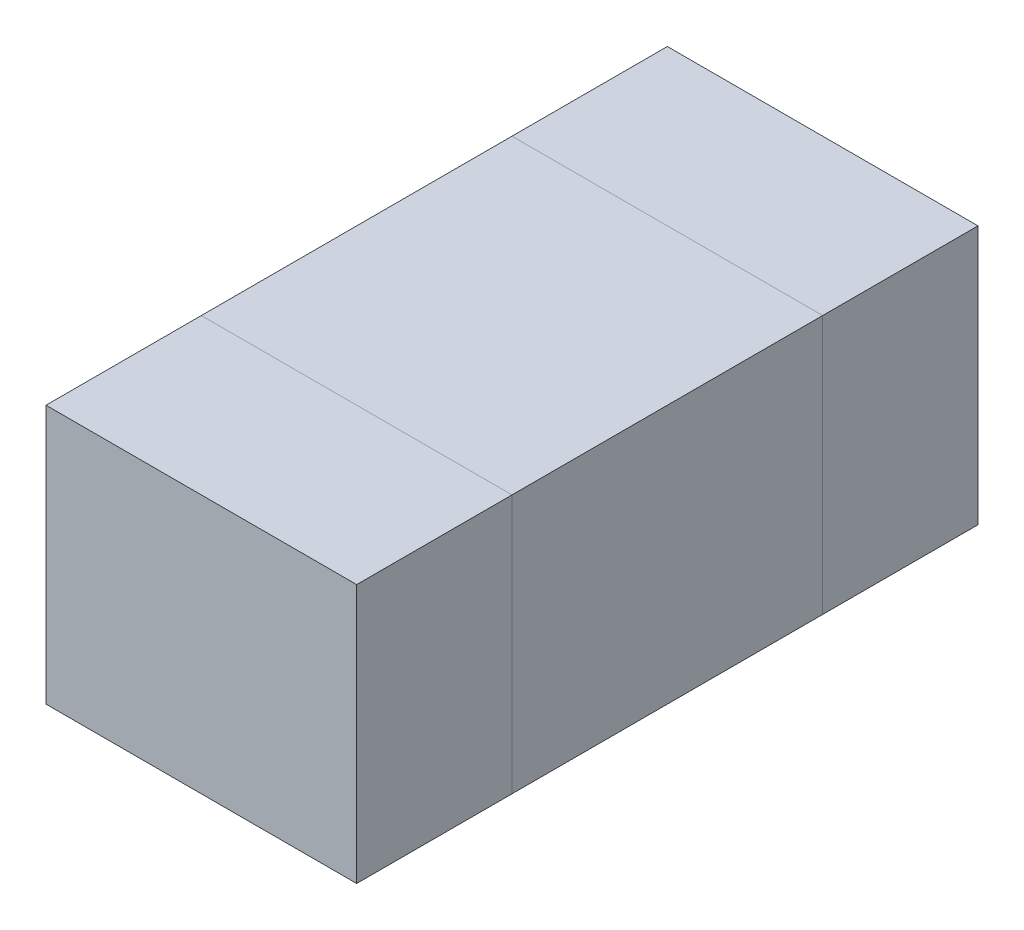
ISO-10303-21;
HEADER;
FILE_DESCRIPTION(('STEP AP214'),'2;1');
FILE_NAME('part.step','',(''),(''),'','','');
FILE_SCHEMA(('AUTOMOTIVE_DESIGN { 1 0 10303 214 1 1 1 1 }'));
ENDSEC;
DATA;
#1=APPLICATION_CONTEXT('core data for automotive mechanical design processes');
#2=APPLICATION_PROTOCOL_DEFINITION('international standard','automotive_design',2000,#1);
#3=PRODUCT_CONTEXT('',#1,'mechanical');
#4=PRODUCT('Part','Part','',(#3));
#5=PRODUCT_RELATED_PRODUCT_CATEGORY('part','',(#4));
#6=PRODUCT_DEFINITION_FORMATION('','',#4);
#7=PRODUCT_DEFINITION_CONTEXT('part definition',#1,'design');
#8=PRODUCT_DEFINITION('design','',#6,#7);
#9=PRODUCT_DEFINITION_SHAPE('','',#8);
#10=(LENGTH_UNIT() NAMED_UNIT(*) SI_UNIT(.MILLI.,.METRE.));
#11=(NAMED_UNIT(*) PLANE_ANGLE_UNIT() SI_UNIT($,.RADIAN.));
#12=(NAMED_UNIT(*) SI_UNIT($,.STERADIAN.) SOLID_ANGLE_UNIT());
#13=UNCERTAINTY_MEASURE_WITH_UNIT(LENGTH_MEASURE(1.E-05),#10,'distance_accuracy_value','');
#14=(GEOMETRIC_REPRESENTATION_CONTEXT(3) GLOBAL_UNCERTAINTY_ASSIGNED_CONTEXT((#13)) GLOBAL_UNIT_ASSIGNED_CONTEXT((#10,
#11,#12)) REPRESENTATION_CONTEXT('',''));
#15=CARTESIAN_POINT('',(0.,0.,0.));
#16=DIRECTION('',(0.,0.,1.));
#17=DIRECTION('',(1.,0.,0.));
#18=AXIS2_PLACEMENT_3D('',#15,#16,#17);
#19=CARTESIAN_POINT('',(0.,0.,0.));
#20=DIRECTION('',(0.,1.,0.));
#21=DIRECTION('',(1.,0.,0.));
#22=AXIS2_PLACEMENT_3D('',#19,#20,#21);
#23=PLANE('',#22);
#24=DIRECTION('',(0.,0.,-1.));
#25=VECTOR('',#24,1.);
#26=CARTESIAN_POINT('',(0.3,0.,-0.3));
#27=LINE('',#26,#25);
#28=CARTESIAN_POINT('',(0.3,0.,0.3));
#29=VERTEX_POINT('',#28);
#30=CARTESIAN_POINT('',(0.3,0.,-0.3));
#31=VERTEX_POINT('',#30);
#32=EDGE_CURVE('P0_E109',#29,#31,#27,.T.);
#33=ORIENTED_EDGE('',*,*,#32,.F.);
#34=DIRECTION('',(1.,0.,0.));
#35=VECTOR('',#34,1.);
#36=CARTESIAN_POINT('',(-0.3,0.,0.3));
#37=LINE('',#36,#35);
#38=CARTESIAN_POINT('',(-0.3,0.,0.3));
#39=VERTEX_POINT('',#38);
#40=EDGE_CURVE('P0_E27',#39,#29,#37,.T.);
#41=ORIENTED_EDGE('',*,*,#40,.F.);
#42=DIRECTION('',(0.,0.,1.));
#43=VECTOR('',#42,1.);
#44=CARTESIAN_POINT('',(-0.3,0.,-0.3));
#45=LINE('',#44,#43);
#46=CARTESIAN_POINT('',(-0.3,0.,-0.3));
#47=VERTEX_POINT('',#46);
#48=EDGE_CURVE('P0_E20',#47,#39,#45,.T.);
#49=ORIENTED_EDGE('',*,*,#48,.F.);
#50=DIRECTION('',(-1.,0.,0.));
#51=VECTOR('',#50,1.);
#52=CARTESIAN_POINT('',(-0.3,0.,-0.3));
#53=LINE('',#52,#51);
#54=EDGE_CURVE('P0_E76',#31,#47,#53,.T.);
#55=ORIENTED_EDGE('',*,*,#54,.F.);
#56=EDGE_LOOP('',(#33,#41,#49,#55));
#57=FACE_BOUND('',#56,.T.);
#58=ADVANCED_FACE('P0_F16',(#57),#23,.F.);
#59=CARTESIAN_POINT('',(0.,0.5,0.));
#60=DIRECTION('',(0.,1.,0.));
#61=DIRECTION('',(1.,0.,0.));
#62=AXIS2_PLACEMENT_3D('',#59,#60,#61);
#63=PLANE('',#62);
#64=DIRECTION('',(0.,0.,-1.));
#65=VECTOR('',#64,1.);
#66=CARTESIAN_POINT('',(0.3,0.5,-0.3));
#67=LINE('',#66,#65);
#68=CARTESIAN_POINT('',(0.3,0.5,0.3));
#69=VERTEX_POINT('',#68);
#70=CARTESIAN_POINT('',(0.3,0.5,-0.3));
#71=VERTEX_POINT('',#70);
#72=EDGE_CURVE('P0_E103',#69,#71,#67,.T.);
#73=ORIENTED_EDGE('',*,*,#72,.T.);
#74=DIRECTION('',(-1.,0.,0.));
#75=VECTOR('',#74,1.);
#76=CARTESIAN_POINT('',(-0.3,0.5,-0.3));
#77=LINE('',#76,#75);
#78=CARTESIAN_POINT('',(-0.3,0.5,-0.3));
#79=VERTEX_POINT('',#78);
#80=EDGE_CURVE('P0_E82',#71,#79,#77,.T.);
#81=ORIENTED_EDGE('',*,*,#80,.T.);
#82=DIRECTION('',(0.,0.,1.));
#83=VECTOR('',#82,1.);
#84=CARTESIAN_POINT('',(-0.3,0.5,-0.3));
#85=LINE('',#84,#83);
#86=CARTESIAN_POINT('',(-0.3,0.5,0.3));
#87=VERTEX_POINT('',#86);
#88=EDGE_CURVE('P0_E86',#79,#87,#85,.T.);
#89=ORIENTED_EDGE('',*,*,#88,.T.);
#90=DIRECTION('',(1.,0.,0.));
#91=VECTOR('',#90,1.);
#92=CARTESIAN_POINT('',(-0.3,0.5,0.3));
#93=LINE('',#92,#91);
#94=EDGE_CURVE('P0_E11',#87,#69,#93,.T.);
#95=ORIENTED_EDGE('',*,*,#94,.T.);
#96=EDGE_LOOP('',(#73,#81,#89,#95));
#97=FACE_BOUND('',#96,.T.);
#98=ADVANCED_FACE('P0_F18',(#97),#63,.T.);
#99=CARTESIAN_POINT('',(-0.3,0.5,0.3));
#100=DIRECTION('',(0.,0.,-1.));
#101=DIRECTION('',(0.,-1.,0.));
#102=AXIS2_PLACEMENT_3D('',#99,#100,#101);
#103=PLANE('',#102);
#104=ORIENTED_EDGE('',*,*,#40,.T.);
#105=DIRECTION('',(0.,-1.,0.));
#106=VECTOR('',#105,1.);
#107=CARTESIAN_POINT('',(0.3,0.5,0.3));
#108=LINE('',#107,#106);
#109=EDGE_CURVE('P0_E96',#69,#29,#108,.T.);
#110=ORIENTED_EDGE('',*,*,#109,.F.);
#111=ORIENTED_EDGE('',*,*,#94,.F.);
#112=DIRECTION('',(0.,-1.,0.));
#113=VECTOR('',#112,1.);
#114=CARTESIAN_POINT('',(-0.3,0.5,0.3));
#115=LINE('',#114,#113);
#116=EDGE_CURVE('P0_E81',#87,#39,#115,.T.);
#117=ORIENTED_EDGE('',*,*,#116,.T.);
#118=EDGE_LOOP('',(#104,#110,#111,#117));
#119=FACE_BOUND('',#118,.T.);
#120=ADVANCED_FACE('P0_F122',(#119),#103,.F.);
#121=CARTESIAN_POINT('',(-0.3,0.5,-0.3));
#122=DIRECTION('',(1.,0.,0.));
#123=DIRECTION('',(0.,0.,-1.));
#124=AXIS2_PLACEMENT_3D('',#121,#122,#123);
#125=PLANE('',#124);
#126=ORIENTED_EDGE('',*,*,#48,.T.);
#127=ORIENTED_EDGE('',*,*,#116,.F.);
#128=ORIENTED_EDGE('',*,*,#88,.F.);
#129=DIRECTION('',(0.,-1.,0.));
#130=VECTOR('',#129,1.);
#131=CARTESIAN_POINT('',(-0.3,0.5,-0.3));
#132=LINE('',#131,#130);
#133=EDGE_CURVE('P0_E84',#79,#47,#132,.T.);
#134=ORIENTED_EDGE('',*,*,#133,.T.);
#135=EDGE_LOOP('',(#126,#127,#128,#134));
#136=FACE_BOUND('',#135,.T.);
#137=ADVANCED_FACE('P0_F85',(#136),#125,.F.);
#138=CARTESIAN_POINT('',(-0.3,0.5,-0.3));
#139=DIRECTION('',(0.,0.,1.));
#140=DIRECTION('',(1.,0.,0.));
#141=AXIS2_PLACEMENT_3D('',#138,#139,#140);
#142=PLANE('',#141);
#143=ORIENTED_EDGE('',*,*,#54,.T.);
#144=ORIENTED_EDGE('',*,*,#133,.F.);
#145=ORIENTED_EDGE('',*,*,#80,.F.);
#146=DIRECTION('',(0.,-1.,0.));
#147=VECTOR('',#146,1.);
#148=CARTESIAN_POINT('',(0.3,0.5,-0.3));
#149=LINE('',#148,#147);
#150=EDGE_CURVE('P0_E93',#71,#31,#149,.T.);
#151=ORIENTED_EDGE('',*,*,#150,.T.);
#152=EDGE_LOOP('',(#143,#144,#145,#151));
#153=FACE_BOUND('',#152,.T.);
#154=ADVANCED_FACE('P0_F91',(#153),#142,.F.);
#155=CARTESIAN_POINT('',(0.3,0.5,-0.3));
#156=DIRECTION('',(-1.,0.,0.));
#157=DIRECTION('',(0.,1.,0.));
#158=AXIS2_PLACEMENT_3D('',#155,#156,#157);
#159=PLANE('',#158);
#160=ORIENTED_EDGE('',*,*,#32,.T.);
#161=ORIENTED_EDGE('',*,*,#150,.F.);
#162=ORIENTED_EDGE('',*,*,#72,.F.);
#163=ORIENTED_EDGE('',*,*,#109,.T.);
#164=EDGE_LOOP('',(#160,#161,#162,#163));
#165=FACE_BOUND('',#164,.T.);
#166=ADVANCED_FACE('P0_F121',(#165),#159,.F.);
#167=CLOSED_SHELL('',(#58,#98,#120,#137,#154,#166));
#168=MANIFOLD_SOLID_BREP('P0_B1',#167);
#169=CARTESIAN_POINT('',(-0.3,1.17082039324994,0.3));
#170=DIRECTION('',(-1.,0.,0.));
#171=DIRECTION('',(0.,0.,1.));
#172=AXIS2_PLACEMENT_3D('',#169,#170,#171);
#173=PLANE('',#172);
#174=DIRECTION('',(0.,-1.,0.));
#175=VECTOR('',#174,1.);
#176=CARTESIAN_POINT('',(-0.3,1.17082039324994,0.6));
#177=LINE('',#176,#175);
#178=CARTESIAN_POINT('',(-0.3,0.5,0.6));
#179=VERTEX_POINT('',#178);
#180=CARTESIAN_POINT('',(-0.3,0.,0.6));
#181=VERTEX_POINT('',#180);
#182=EDGE_CURVE('P1_E11',#179,#181,#177,.T.);
#183=ORIENTED_EDGE('',*,*,#182,.F.);
#184=DIRECTION('',(0.,0.,-1.));
#185=VECTOR('',#184,1.);
#186=CARTESIAN_POINT('',(-0.3,0.5,0.3));
#187=LINE('',#186,#185);
#188=CARTESIAN_POINT('',(-0.3,0.5,0.3));
#189=VERTEX_POINT('',#188);
#190=EDGE_CURVE('P1_E86',#179,#189,#187,.T.);
#191=ORIENTED_EDGE('',*,*,#190,.T.);
#192=DIRECTION('',(0.,-1.,0.));
#193=VECTOR('',#192,1.);
#194=CARTESIAN_POINT('',(-0.3,1.17082039324994,0.3));
#195=LINE('',#194,#193);
#196=CARTESIAN_POINT('',(-0.3,0.,0.3));
#197=VERTEX_POINT('',#196);
#198=EDGE_CURVE('P1_E102',#189,#197,#195,.T.);
#199=ORIENTED_EDGE('',*,*,#198,.T.);
#200=DIRECTION('',(0.,0.,-1.));
#201=VECTOR('',#200,1.);
#202=CARTESIAN_POINT('',(-0.3,0.,0.3));
#203=LINE('',#202,#201);
#204=EDGE_CURVE('P1_E98',#181,#197,#203,.T.);
#205=ORIENTED_EDGE('',*,*,#204,.F.);
#206=EDGE_LOOP('',(#183,#191,#199,#205));
#207=FACE_BOUND('',#206,.T.);
#208=ADVANCED_FACE('P1_F16',(#207),#173,.T.);
#209=CARTESIAN_POINT('',(-0.3,1.17082039324994,0.6));
#210=DIRECTION('',(0.,0.,1.));
#211=DIRECTION('',(1.,0.,0.));
#212=AXIS2_PLACEMENT_3D('',#209,#210,#211);
#213=PLANE('',#212);
#214=DIRECTION('',(0.,-1.,0.));
#215=VECTOR('',#214,1.);
#216=CARTESIAN_POINT('',(0.3,1.17082039324994,0.6));
#217=LINE('',#216,#215);
#218=CARTESIAN_POINT('',(0.3,0.5,0.6));
#219=VERTEX_POINT('',#218);
#220=CARTESIAN_POINT('',(0.3,0.,0.6));
#221=VERTEX_POINT('',#220);
#222=EDGE_CURVE('P1_E19',#219,#221,#217,.T.);
#223=ORIENTED_EDGE('',*,*,#222,.F.);
#224=DIRECTION('',(-1.,0.,0.));
#225=VECTOR('',#224,1.);
#226=CARTESIAN_POINT('',(-0.3,0.5,0.6));
#227=LINE('',#226,#225);
#228=EDGE_CURVE('P1_E70',#219,#179,#227,.T.);
#229=ORIENTED_EDGE('',*,*,#228,.T.);
#230=ORIENTED_EDGE('',*,*,#182,.T.);
#231=DIRECTION('',(-1.,0.,0.));
#232=VECTOR('',#231,1.);
#233=CARTESIAN_POINT('',(-0.3,0.,0.6));
#234=LINE('',#233,#232);
#235=EDGE_CURVE('P1_E73',#221,#181,#234,.T.);
#236=ORIENTED_EDGE('',*,*,#235,.F.);
#237=EDGE_LOOP('',(#223,#229,#230,#236));
#238=FACE_BOUND('',#237,.T.);
#239=ADVANCED_FACE('P1_F68',(#238),#213,.T.);
#240=CARTESIAN_POINT('',(0.3,1.17082039324994,0.3));
#241=DIRECTION('',(1.,0.,0.));
#242=DIRECTION('',(0.,1.,0.));
#243=AXIS2_PLACEMENT_3D('',#240,#241,#242);
#244=PLANE('',#243);
#245=DIRECTION('',(0.,-1.,0.));
#246=VECTOR('',#245,1.);
#247=CARTESIAN_POINT('',(0.3,1.17082039324994,0.3));
#248=LINE('',#247,#246);
#249=CARTESIAN_POINT('',(0.3,0.5,0.3));
#250=VERTEX_POINT('',#249);
#251=CARTESIAN_POINT('',(0.3,0.,0.3));
#252=VERTEX_POINT('',#251);
#253=EDGE_CURVE('P1_E61',#250,#252,#248,.T.);
#254=ORIENTED_EDGE('',*,*,#253,.F.);
#255=DIRECTION('',(0.,0.,1.));
#256=VECTOR('',#255,1.);
#257=CARTESIAN_POINT('',(0.3,0.5,0.3));
#258=LINE('',#257,#256);
#259=EDGE_CURVE('P1_E77',#250,#219,#258,.T.);
#260=ORIENTED_EDGE('',*,*,#259,.T.);
#261=ORIENTED_EDGE('',*,*,#222,.T.);
#262=DIRECTION('',(0.,0.,1.));
#263=VECTOR('',#262,1.);
#264=CARTESIAN_POINT('',(0.3,0.,0.3));
#265=LINE('',#264,#263);
#266=EDGE_CURVE('P1_E105',#252,#221,#265,.T.);
#267=ORIENTED_EDGE('',*,*,#266,.F.);
#268=EDGE_LOOP('',(#254,#260,#261,#267));
#269=FACE_BOUND('',#268,.T.);
#270=ADVANCED_FACE('P1_F78',(#269),#244,.T.);
#271=CARTESIAN_POINT('',(-0.3,1.17082039324994,0.3));
#272=DIRECTION('',(0.,0.,-1.));
#273=DIRECTION('',(0.,-1.,0.));
#274=AXIS2_PLACEMENT_3D('',#271,#272,#273);
#275=PLANE('',#274);
#276=ORIENTED_EDGE('',*,*,#198,.F.);
#277=DIRECTION('',(1.,0.,0.));
#278=VECTOR('',#277,1.);
#279=CARTESIAN_POINT('',(-0.3,0.5,0.3));
#280=LINE('',#279,#278);
#281=EDGE_CURVE('P1_E82',#189,#250,#280,.T.);
#282=ORIENTED_EDGE('',*,*,#281,.T.);
#283=ORIENTED_EDGE('',*,*,#253,.T.);
#284=DIRECTION('',(1.,0.,0.));
#285=VECTOR('',#284,1.);
#286=CARTESIAN_POINT('',(-0.3,0.,0.3));
#287=LINE('',#286,#285);
#288=EDGE_CURVE('P1_E96',#197,#252,#287,.T.);
#289=ORIENTED_EDGE('',*,*,#288,.F.);
#290=EDGE_LOOP('',(#276,#282,#283,#289));
#291=FACE_BOUND('',#290,.T.);
#292=ADVANCED_FACE('P1_F120',(#291),#275,.T.);
#293=CARTESIAN_POINT('',(0.,0.,0.));
#294=DIRECTION('',(0.,1.,0.));
#295=DIRECTION('',(1.,0.,0.));
#296=AXIS2_PLACEMENT_3D('',#293,#294,#295);
#297=PLANE('',#296);
#298=ORIENTED_EDGE('',*,*,#204,.T.);
#299=ORIENTED_EDGE('',*,*,#288,.T.);
#300=ORIENTED_EDGE('',*,*,#266,.T.);
#301=ORIENTED_EDGE('',*,*,#235,.T.);
#302=EDGE_LOOP('',(#298,#299,#300,#301));
#303=FACE_BOUND('',#302,.T.);
#304=ADVANCED_FACE('P1_F117',(#303),#297,.F.);
#305=CARTESIAN_POINT('',(0.,0.5,0.));
#306=DIRECTION('',(0.,1.,0.));
#307=DIRECTION('',(1.,0.,0.));
#308=AXIS2_PLACEMENT_3D('',#305,#306,#307);
#309=PLANE('',#308);
#310=ORIENTED_EDGE('',*,*,#190,.F.);
#311=ORIENTED_EDGE('',*,*,#228,.F.);
#312=ORIENTED_EDGE('',*,*,#259,.F.);
#313=ORIENTED_EDGE('',*,*,#281,.F.);
#314=EDGE_LOOP('',(#310,#311,#312,#313));
#315=FACE_BOUND('',#314,.T.);
#316=ADVANCED_FACE('P1_F84',(#315),#309,.T.);
#317=CLOSED_SHELL('',(#208,#239,#270,#292,#304,#316));
#318=MANIFOLD_SOLID_BREP('P1_B1',#317);
#319=CARTESIAN_POINT('',(-0.3,1.17082039324994,-0.3));
#320=DIRECTION('',(-1.,0.,0.));
#321=DIRECTION('',(0.,0.,1.));
#322=AXIS2_PLACEMENT_3D('',#319,#320,#321);
#323=PLANE('',#322);
#324=DIRECTION('',(0.,-1.,0.));
#325=VECTOR('',#324,1.);
#326=CARTESIAN_POINT('',(-0.3,1.17082039324994,-0.3));
#327=LINE('',#326,#325);
#328=CARTESIAN_POINT('',(-0.3,0.5,-0.3));
#329=VERTEX_POINT('',#328);
#330=CARTESIAN_POINT('',(-0.3,0.,-0.3));
#331=VERTEX_POINT('',#330);
#332=EDGE_CURVE('P2_E11',#329,#331,#327,.T.);
#333=ORIENTED_EDGE('',*,*,#332,.F.);
#334=DIRECTION('',(0.,0.,-1.));
#335=VECTOR('',#334,1.);
#336=CARTESIAN_POINT('',(-0.3,0.5,-0.3));
#337=LINE('',#336,#335);
#338=CARTESIAN_POINT('',(-0.3,0.5,-0.6));
#339=VERTEX_POINT('',#338);
#340=EDGE_CURVE('P2_E66',#329,#339,#337,.T.);
#341=ORIENTED_EDGE('',*,*,#340,.T.);
#342=DIRECTION('',(0.,-1.,0.));
#343=VECTOR('',#342,1.);
#344=CARTESIAN_POINT('',(-0.3,1.17082039324994,-0.6));
#345=LINE('',#344,#343);
#346=CARTESIAN_POINT('',(-0.3,0.,-0.6));
#347=VERTEX_POINT('',#346);
#348=EDGE_CURVE('P2_E92',#339,#347,#345,.T.);
#349=ORIENTED_EDGE('',*,*,#348,.T.);
#350=DIRECTION('',(0.,0.,-1.));
#351=VECTOR('',#350,1.);
#352=CARTESIAN_POINT('',(-0.3,0.,-0.3));
#353=LINE('',#352,#351);
#354=EDGE_CURVE('P2_E69',#331,#347,#353,.T.);
#355=ORIENTED_EDGE('',*,*,#354,.F.);
#356=EDGE_LOOP('',(#333,#341,#349,#355));
#357=FACE_BOUND('',#356,.T.);
#358=ADVANCED_FACE('P2_F16',(#357),#323,.T.);
#359=CARTESIAN_POINT('',(-0.3,1.17082039324994,-0.3));
#360=DIRECTION('',(0.,0.,1.));
#361=DIRECTION('',(1.,0.,0.));
#362=AXIS2_PLACEMENT_3D('',#359,#360,#361);
#363=PLANE('',#362);
#364=DIRECTION('',(0.,-1.,0.));
#365=VECTOR('',#364,1.);
#366=CARTESIAN_POINT('',(0.3,1.17082039324994,-0.3));
#367=LINE('',#366,#365);
#368=CARTESIAN_POINT('',(0.3,0.5,-0.3));
#369=VERTEX_POINT('',#368);
#370=CARTESIAN_POINT('',(0.3,0.,-0.3));
#371=VERTEX_POINT('',#370);
#372=EDGE_CURVE('P2_E27',#369,#371,#367,.T.);
#373=ORIENTED_EDGE('',*,*,#372,.F.);
#374=DIRECTION('',(-1.,0.,0.));
#375=VECTOR('',#374,1.);
#376=CARTESIAN_POINT('',(-0.3,0.5,-0.3));
#377=LINE('',#376,#375);
#378=EDGE_CURVE('P2_E73',#369,#329,#377,.T.);
#379=ORIENTED_EDGE('',*,*,#378,.T.);
#380=ORIENTED_EDGE('',*,*,#332,.T.);
#381=DIRECTION('',(-1.,0.,0.));
#382=VECTOR('',#381,1.);
#383=CARTESIAN_POINT('',(-0.3,0.,-0.3));
#384=LINE('',#383,#382);
#385=EDGE_CURVE('P2_E90',#371,#331,#384,.T.);
#386=ORIENTED_EDGE('',*,*,#385,.F.);
#387=EDGE_LOOP('',(#373,#379,#380,#386));
#388=FACE_BOUND('',#387,.T.);
#389=ADVANCED_FACE('P2_F74',(#388),#363,.T.);
#390=CARTESIAN_POINT('',(0.3,1.17082039324994,-0.3));
#391=DIRECTION('',(1.,0.,0.));
#392=DIRECTION('',(0.,0.,1.));
#393=AXIS2_PLACEMENT_3D('',#390,#391,#392);
#394=PLANE('',#393);
#395=DIRECTION('',(0.,-1.,0.));
#396=VECTOR('',#395,1.);
#397=CARTESIAN_POINT('',(0.3,1.17082039324994,-0.6));
#398=LINE('',#397,#396);
#399=CARTESIAN_POINT('',(0.3,0.5,-0.6));
#400=VERTEX_POINT('',#399);
#401=CARTESIAN_POINT('',(0.3,0.,-0.6));
#402=VERTEX_POINT('',#401);
#403=EDGE_CURVE('P2_E99',#400,#402,#398,.T.);
#404=ORIENTED_EDGE('',*,*,#403,.F.);
#405=DIRECTION('',(0.,0.,1.));
#406=VECTOR('',#405,1.);
#407=CARTESIAN_POINT('',(0.3,0.5,-0.3));
#408=LINE('',#407,#406);
#409=EDGE_CURVE('P2_E78',#400,#369,#408,.T.);
#410=ORIENTED_EDGE('',*,*,#409,.T.);
#411=ORIENTED_EDGE('',*,*,#372,.T.);
#412=DIRECTION('',(0.,0.,1.));
#413=VECTOR('',#412,1.);
#414=CARTESIAN_POINT('',(0.3,0.,-0.3));
#415=LINE('',#414,#413);
#416=EDGE_CURVE('P2_E20',#402,#371,#415,.T.);
#417=ORIENTED_EDGE('',*,*,#416,.F.);
#418=EDGE_LOOP('',(#404,#410,#411,#417));
#419=FACE_BOUND('',#418,.T.);
#420=ADVANCED_FACE('P2_F121',(#419),#394,.T.);
#421=CARTESIAN_POINT('',(-0.3,1.17082039324994,-0.6));
#422=DIRECTION('',(0.,0.,-1.));
#423=DIRECTION('',(0.,-1.,0.));
#424=AXIS2_PLACEMENT_3D('',#421,#422,#423);
#425=PLANE('',#424);
#426=ORIENTED_EDGE('',*,*,#348,.F.);
#427=DIRECTION('',(1.,0.,0.));
#428=VECTOR('',#427,1.);
#429=CARTESIAN_POINT('',(-0.3,0.5,-0.6));
#430=LINE('',#429,#428);
#431=EDGE_CURVE('P2_E83',#339,#400,#430,.T.);
#432=ORIENTED_EDGE('',*,*,#431,.T.);
#433=ORIENTED_EDGE('',*,*,#403,.T.);
#434=DIRECTION('',(1.,0.,0.));
#435=VECTOR('',#434,1.);
#436=CARTESIAN_POINT('',(-0.3,0.,-0.6));
#437=LINE('',#436,#435);
#438=EDGE_CURVE('P2_E101',#347,#402,#437,.T.);
#439=ORIENTED_EDGE('',*,*,#438,.F.);
#440=EDGE_LOOP('',(#426,#432,#433,#439));
#441=FACE_BOUND('',#440,.T.);
#442=ADVANCED_FACE('P2_F18',(#441),#425,.T.);
#443=CARTESIAN_POINT('',(0.,0.,0.));
#444=DIRECTION('',(0.,-1.,0.));
#445=DIRECTION('',(0.,0.,-1.));
#446=AXIS2_PLACEMENT_3D('',#443,#444,#445);
#447=PLANE('',#446);
#448=ORIENTED_EDGE('',*,*,#354,.T.);
#449=ORIENTED_EDGE('',*,*,#438,.T.);
#450=ORIENTED_EDGE('',*,*,#416,.T.);
#451=ORIENTED_EDGE('',*,*,#385,.T.);
#452=EDGE_LOOP('',(#448,#449,#450,#451));
#453=FACE_BOUND('',#452,.T.);
#454=ADVANCED_FACE('P2_F133',(#453),#447,.T.);
#455=CARTESIAN_POINT('',(0.,0.5,0.));
#456=DIRECTION('',(0.,1.,0.));
#457=DIRECTION('',(1.,0.,0.));
#458=AXIS2_PLACEMENT_3D('',#455,#456,#457);
#459=PLANE('',#458);
#460=ORIENTED_EDGE('',*,*,#340,.F.);
#461=ORIENTED_EDGE('',*,*,#378,.F.);
#462=ORIENTED_EDGE('',*,*,#409,.F.);
#463=ORIENTED_EDGE('',*,*,#431,.F.);
#464=EDGE_LOOP('',(#460,#461,#462,#463));
#465=FACE_BOUND('',#464,.T.);
#466=ADVANCED_FACE('P2_F81',(#465),#459,.T.);
#467=CLOSED_SHELL('',(#358,#389,#420,#442,#454,#466));
#468=MANIFOLD_SOLID_BREP('P2_B1',#467);
#469=ADVANCED_BREP_SHAPE_REPRESENTATION('',(#18,#168,#318,#468),#14);
#470=SHAPE_DEFINITION_REPRESENTATION(#9,#469);
ENDSEC;
END-ISO-10303-21;
